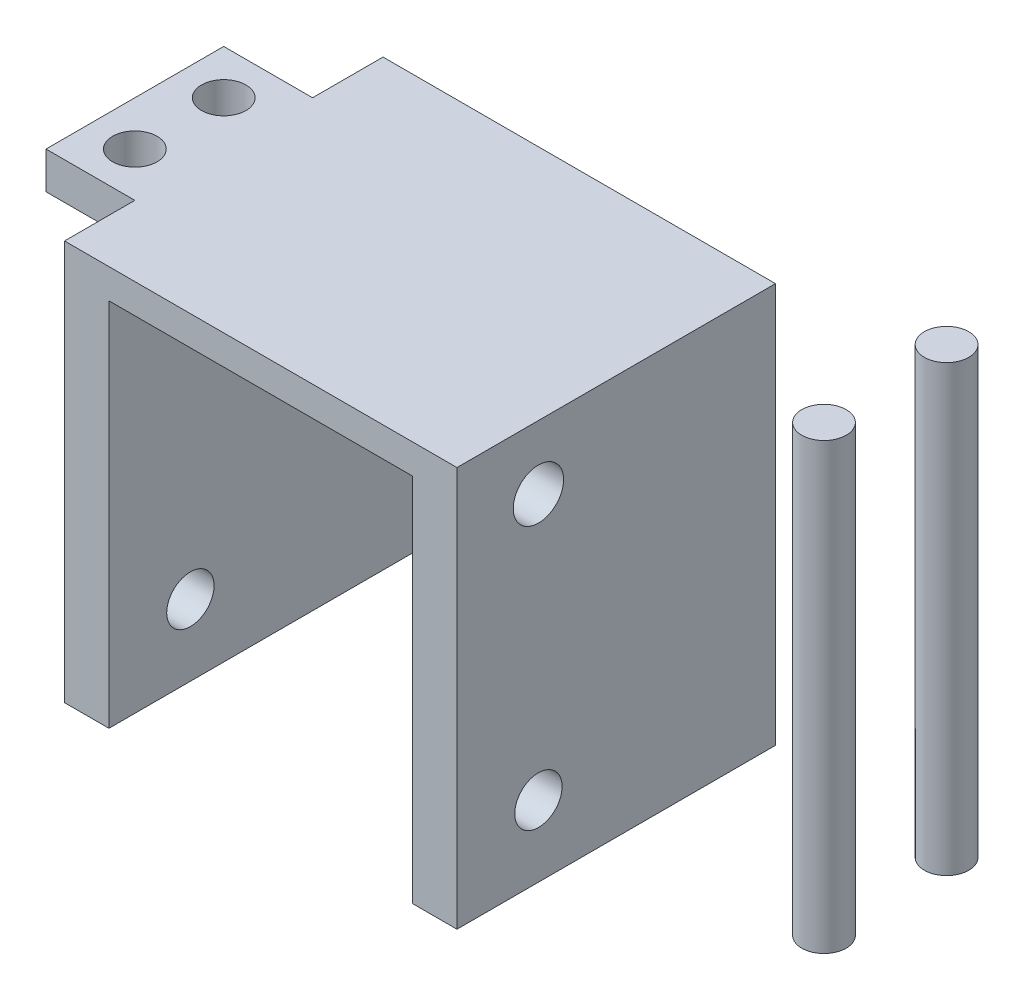
ISO-10303-21;
HEADER;
FILE_DESCRIPTION(('STEP AP214'),'2;1');
FILE_NAME('part.step','',(''),(''),'','','');
FILE_SCHEMA(('AUTOMOTIVE_DESIGN { 1 0 10303 214 1 1 1 1 }'));
ENDSEC;
DATA;
#1=APPLICATION_CONTEXT('core data for automotive mechanical design processes');
#2=APPLICATION_PROTOCOL_DEFINITION('international standard','automotive_design',2000,#1);
#3=PRODUCT_CONTEXT('',#1,'mechanical');
#4=PRODUCT('Part','Part','',(#3));
#5=PRODUCT_RELATED_PRODUCT_CATEGORY('part','',(#4));
#6=PRODUCT_DEFINITION_FORMATION('','',#4);
#7=PRODUCT_DEFINITION_CONTEXT('part definition',#1,'design');
#8=PRODUCT_DEFINITION('design','',#6,#7);
#9=PRODUCT_DEFINITION_SHAPE('','',#8);
#10=(LENGTH_UNIT() NAMED_UNIT(*) SI_UNIT(.MILLI.,.METRE.));
#11=(NAMED_UNIT(*) PLANE_ANGLE_UNIT() SI_UNIT($,.RADIAN.));
#12=(NAMED_UNIT(*) SI_UNIT($,.STERADIAN.) SOLID_ANGLE_UNIT());
#13=UNCERTAINTY_MEASURE_WITH_UNIT(LENGTH_MEASURE(1.E-05),#10,'distance_accuracy_value','');
#14=(GEOMETRIC_REPRESENTATION_CONTEXT(3) GLOBAL_UNCERTAINTY_ASSIGNED_CONTEXT((#13)) GLOBAL_UNIT_ASSIGNED_CONTEXT((#10,
#11,#12)) REPRESENTATION_CONTEXT('',''));
#15=CARTESIAN_POINT('',(0.,0.,0.));
#16=DIRECTION('',(0.,0.,1.));
#17=DIRECTION('',(1.,0.,0.));
#18=AXIS2_PLACEMENT_3D('',#15,#16,#17);
#19=CARTESIAN_POINT('',(7.57435055107238,-37.9640136599524,21.6698122934481));
#20=DIRECTION('',(0.,1.,0.));
#21=DIRECTION('',(-1.,0.,0.));
#22=AXIS2_PLACEMENT_3D('',#19,#20,#21);
#23=CYLINDRICAL_SURFACE('',#22,1.5);
#24=CARTESIAN_POINT('',(7.57435055107238,-37.9640136599524,21.6698122934481));
#25=DIRECTION('',(0.,1.,0.));
#26=DIRECTION('',(-1.,0.,0.));
#27=AXIS2_PLACEMENT_3D('',#24,#25,#26);
#28=CIRCLE('',#27,1.5);
#29=CARTESIAN_POINT('',(6.07435055107238,-37.9640136599524,21.6698122934481));
#30=VERTEX_POINT('',#29);
#31=EDGE_CURVE('E50',#30,#30,#28,.T.);
#32=ORIENTED_EDGE('',*,*,#31,.T.);
#33=EDGE_LOOP('',(#32));
#34=FACE_BOUND('',#33,.T.);
#35=CARTESIAN_POINT('',(7.57435055107237,-7.96401365995245,21.6698122934481));
#36=DIRECTION('',(0.,1.,0.));
#37=DIRECTION('',(-1.,0.,0.));
#38=AXIS2_PLACEMENT_3D('',#35,#36,#37);
#39=CIRCLE('',#38,1.5);
#40=CARTESIAN_POINT('',(6.07435055107237,-7.96401365995245,21.6698122934481));
#41=VERTEX_POINT('',#40);
#42=EDGE_CURVE('E11',#41,#41,#39,.T.);
#43=ORIENTED_EDGE('',*,*,#42,.F.);
#44=EDGE_LOOP('',(#43));
#45=FACE_BOUND('',#44,.T.);
#46=ADVANCED_FACE('F46',(#34,#45),#23,.T.);
#47=CARTESIAN_POINT('',(7.57435055107238,-37.9640136599524,21.6698122934481));
#48=DIRECTION('',(0.,1.,0.));
#49=DIRECTION('',(-1.,0.,0.));
#50=AXIS2_PLACEMENT_3D('',#47,#48,#49);
#51=PLANE('',#50);
#52=ORIENTED_EDGE('',*,*,#31,.F.);
#53=EDGE_LOOP('',(#52));
#54=FACE_BOUND('',#53,.T.);
#55=ADVANCED_FACE('F48',(#54),#51,.F.);
#56=CARTESIAN_POINT('',(7.57435055107237,-7.96401365995245,21.6698122934481));
#57=DIRECTION('',(0.,1.,0.));
#58=DIRECTION('',(-1.,0.,0.));
#59=AXIS2_PLACEMENT_3D('',#56,#57,#58);
#60=PLANE('',#59);
#61=ORIENTED_EDGE('',*,*,#42,.T.);
#62=EDGE_LOOP('',(#61));
#63=FACE_BOUND('',#62,.T.);
#64=ADVANCED_FACE('F62',(#63),#60,.T.);
#65=CLOSED_SHELL('',(#46,#55,#64));
#66=MANIFOLD_SOLID_BREP('B2',#65);
#67=CARTESIAN_POINT('',(7.15742755964301,-37.9640136599524,12.9739899007783));
#68=DIRECTION('',(0.,1.,0.));
#69=DIRECTION('',(-1.,0.,0.));
#70=AXIS2_PLACEMENT_3D('',#67,#68,#69);
#71=CYLINDRICAL_SURFACE('',#70,1.5);
#72=CARTESIAN_POINT('',(7.15742755964301,-37.9640136599524,12.9739899007783));
#73=DIRECTION('',(0.,1.,0.));
#74=DIRECTION('',(-1.,0.,0.));
#75=AXIS2_PLACEMENT_3D('',#72,#73,#74);
#76=CIRCLE('',#75,1.5);
#77=CARTESIAN_POINT('',(5.65742755964301,-37.9640136599524,12.9739899007783));
#78=VERTEX_POINT('',#77);
#79=EDGE_CURVE('E45',#78,#78,#76,.T.);
#80=ORIENTED_EDGE('',*,*,#79,.T.);
#81=EDGE_LOOP('',(#80));
#82=FACE_BOUND('',#81,.T.);
#83=CARTESIAN_POINT('',(7.15742755964301,-7.96401365995245,12.9739899007783));
#84=DIRECTION('',(0.,1.,0.));
#85=DIRECTION('',(-1.,0.,0.));
#86=AXIS2_PLACEMENT_3D('',#83,#84,#85);
#87=CIRCLE('',#86,1.5);
#88=CARTESIAN_POINT('',(5.657427559643,-7.96401365995245,12.9739899007783));
#89=VERTEX_POINT('',#88);
#90=EDGE_CURVE('E99',#89,#89,#87,.T.);
#91=ORIENTED_EDGE('',*,*,#90,.F.);
#92=EDGE_LOOP('',(#91));
#93=FACE_BOUND('',#92,.T.);
#94=ADVANCED_FACE('F96',(#82,#93),#71,.T.);
#95=CARTESIAN_POINT('',(7.15742755964301,-37.9640136599524,12.9739899007783));
#96=DIRECTION('',(0.,1.,0.));
#97=DIRECTION('',(-1.,0.,0.));
#98=AXIS2_PLACEMENT_3D('',#95,#96,#97);
#99=PLANE('',#98);
#100=ORIENTED_EDGE('',*,*,#79,.F.);
#101=EDGE_LOOP('',(#100));
#102=FACE_BOUND('',#101,.T.);
#103=ADVANCED_FACE('F111',(#102),#99,.F.);
#104=CARTESIAN_POINT('',(7.15742755964301,-7.96401365995245,12.9739899007783));
#105=DIRECTION('',(0.,1.,0.));
#106=DIRECTION('',(-1.,0.,0.));
#107=AXIS2_PLACEMENT_3D('',#104,#105,#106);
#108=PLANE('',#107);
#109=ORIENTED_EDGE('',*,*,#90,.T.);
#110=EDGE_LOOP('',(#109));
#111=FACE_BOUND('',#110,.T.);
#112=ADVANCED_FACE('F108',(#111),#108,.T.);
#113=CLOSED_SHELL('',(#94,#103,#112));
#114=MANIFOLD_SOLID_BREP('B6',#113);
#115=CARTESIAN_POINT('',(-28.677732695502,-34.9640136599525,36.7));
#116=DIRECTION('',(1.,0.,0.));
#117=DIRECTION('',(0.,1.,0.));
#118=AXIS2_PLACEMENT_3D('',#115,#116,#117);
#119=PLANE('',#118);
#120=CARTESIAN_POINT('',(-28.677732695502,-30.1640136599525,31.2));
#121=DIRECTION('',(1.,0.,0.));
#122=DIRECTION('',(0.,1.,0.));
#123=AXIS2_PLACEMENT_3D('',#120,#121,#122);
#124=CIRCLE('',#123,1.6);
#125=CARTESIAN_POINT('',(-28.677732695502,-28.5640136599525,31.2));
#126=VERTEX_POINT('',#125);
#127=EDGE_CURVE('E283',#126,#126,#124,.T.);
#128=ORIENTED_EDGE('',*,*,#127,.T.);
#129=EDGE_LOOP('',(#128));
#130=FACE_BOUND('',#129,.T.);
#131=CARTESIAN_POINT('',(-28.677732695502,-12.2640136599525,31.2));
#132=DIRECTION('',(1.,0.,0.));
#133=DIRECTION('',(0.,1.,0.));
#134=AXIS2_PLACEMENT_3D('',#131,#132,#133);
#135=CIRCLE('',#134,1.7);
#136=CARTESIAN_POINT('',(-28.677732695502,-10.5640136599525,31.2));
#137=VERTEX_POINT('',#136);
#138=EDGE_CURVE('E290',#137,#137,#135,.T.);
#139=ORIENTED_EDGE('',*,*,#138,.T.);
#140=EDGE_LOOP('',(#139));
#141=FACE_BOUND('',#140,.T.);
#142=DIRECTION('',(0.,1.,0.));
#143=VECTOR('',#142,1.);
#144=CARTESIAN_POINT('',(-28.677732695502,-7.96401365995246,31.95));
#145=LINE('',#144,#143);
#146=CARTESIAN_POINT('',(-28.677732695502,-10.4640136599525,31.95));
#147=VERTEX_POINT('',#146);
#148=CARTESIAN_POINT('',(-28.677732695502,-7.96401365995246,31.95));
#149=VERTEX_POINT('',#148);
#150=EDGE_CURVE('E153',#147,#149,#145,.T.);
#151=ORIENTED_EDGE('',*,*,#150,.F.);
#152=DIRECTION('',(0.,0.,1.));
#153=VECTOR('',#152,1.);
#154=CARTESIAN_POINT('',(-28.677732695502,-10.4640136599525,19.95));
#155=LINE('',#154,#153);
#156=CARTESIAN_POINT('',(-28.677732695502,-10.4640136599525,19.95));
#157=VERTEX_POINT('',#156);
#158=EDGE_CURVE('E247',#157,#147,#155,.T.);
#159=ORIENTED_EDGE('',*,*,#158,.F.);
#160=DIRECTION('',(0.,-1.,0.));
#161=VECTOR('',#160,1.);
#162=CARTESIAN_POINT('',(-28.677732695502,-7.96401365995246,19.95));
#163=LINE('',#162,#161);
#164=CARTESIAN_POINT('',(-28.677732695502,-7.96401365995246,19.95));
#165=VERTEX_POINT('',#164);
#166=EDGE_CURVE('E159',#165,#157,#163,.T.);
#167=ORIENTED_EDGE('',*,*,#166,.F.);
#168=DIRECTION('',(0.,0.,-1.));
#169=VECTOR('',#168,1.);
#170=CARTESIAN_POINT('',(-28.677732695502,-7.96401365995246,36.7));
#171=LINE('',#170,#169);
#172=CARTESIAN_POINT('',(-28.677732695502,-7.96401365995246,15.1914487752555));
#173=VERTEX_POINT('',#172);
#174=EDGE_CURVE('E325',#165,#173,#171,.T.);
#175=ORIENTED_EDGE('',*,*,#174,.T.);
#176=DIRECTION('',(0.,1.,0.));
#177=VECTOR('',#176,1.);
#178=CARTESIAN_POINT('',(-28.677732695502,-34.9640136599525,15.1914487752555));
#179=LINE('',#178,#177);
#180=CARTESIAN_POINT('',(-28.677732695502,-34.9640136599525,15.1914487752555));
#181=VERTEX_POINT('',#180);
#182=EDGE_CURVE('E250',#181,#173,#179,.T.);
#183=ORIENTED_EDGE('',*,*,#182,.F.);
#184=DIRECTION('',(0.,0.,-1.));
#185=VECTOR('',#184,1.);
#186=CARTESIAN_POINT('',(-28.677732695502,-34.9640136599525,36.7));
#187=LINE('',#186,#185);
#188=CARTESIAN_POINT('',(-28.677732695502,-34.9640136599525,36.7));
#189=VERTEX_POINT('',#188);
#190=EDGE_CURVE('E145',#189,#181,#187,.T.);
#191=ORIENTED_EDGE('',*,*,#190,.F.);
#192=DIRECTION('',(0.,-1.,0.));
#193=VECTOR('',#192,1.);
#194=CARTESIAN_POINT('',(-28.677732695502,-34.9640136599525,36.7));
#195=LINE('',#194,#193);
#196=CARTESIAN_POINT('',(-28.677732695502,-7.96401365995246,36.7));
#197=VERTEX_POINT('',#196);
#198=EDGE_CURVE('E306',#197,#189,#195,.T.);
#199=ORIENTED_EDGE('',*,*,#198,.F.);
#200=EDGE_CURVE('E326',#197,#149,#171,.T.);
#201=ORIENTED_EDGE('',*,*,#200,.T.);
#202=EDGE_LOOP('',(#151,#159,#167,#175,#183,#191,#199,#201));
#203=FACE_BOUND('',#202,.T.);
#204=ADVANCED_FACE('F137',(#130,#141,#203),#119,.F.);
#205=CARTESIAN_POINT('',(-2.17773269550204,-34.9640136599524,36.7));
#206=DIRECTION('',(0.,1.,0.));
#207=DIRECTION('',(-1.,0.,0.));
#208=AXIS2_PLACEMENT_3D('',#205,#206,#207);
#209=PLANE('',#208);
#210=DIRECTION('',(0.,0.,-1.));
#211=VECTOR('',#210,1.);
#212=CARTESIAN_POINT('',(-5.17773269550205,-34.9640136599525,36.7));
#213=LINE('',#212,#211);
#214=CARTESIAN_POINT('',(-5.17773269550205,-34.9640136599525,36.7));
#215=VERTEX_POINT('',#214);
#216=CARTESIAN_POINT('',(-5.17773269550205,-34.9640136599525,15.1914487752555));
#217=VERTEX_POINT('',#216);
#218=EDGE_CURVE('E302',#215,#217,#213,.T.);
#219=ORIENTED_EDGE('',*,*,#218,.T.);
#220=DIRECTION('',(-1.,0.,0.));
#221=VECTOR('',#220,1.);
#222=CARTESIAN_POINT('',(3.32226730449796,-34.9640136599525,15.1914487752555));
#223=LINE('',#222,#221);
#224=CARTESIAN_POINT('',(-2.17773269550204,-34.9640136599525,15.1914487752555));
#225=VERTEX_POINT('',#224);
#226=EDGE_CURVE('E260',#225,#217,#223,.T.);
#227=ORIENTED_EDGE('',*,*,#226,.F.);
#228=DIRECTION('',(0.,0.,-1.));
#229=VECTOR('',#228,1.);
#230=CARTESIAN_POINT('',(-2.17773269550204,-34.9640136599524,36.7));
#231=LINE('',#230,#229);
#232=CARTESIAN_POINT('',(-2.17773269550204,-34.9640136599524,36.7));
#233=VERTEX_POINT('',#232);
#234=EDGE_CURVE('E330',#233,#225,#231,.T.);
#235=ORIENTED_EDGE('',*,*,#234,.F.);
#236=DIRECTION('',(1.,0.,0.));
#237=VECTOR('',#236,1.);
#238=CARTESIAN_POINT('',(-2.17773269550204,-34.9640136599524,36.7));
#239=LINE('',#238,#237);
#240=EDGE_CURVE('E317',#215,#233,#239,.T.);
#241=ORIENTED_EDGE('',*,*,#240,.F.);
#242=EDGE_LOOP('',(#219,#227,#235,#241));
#243=FACE_BOUND('',#242,.T.);
#244=ADVANCED_FACE('F376',(#243),#209,.F.);
#245=ORIENTED_EDGE('',*,*,#190,.T.);
#246=CARTESIAN_POINT('',(-25.677732695502,-34.9640136599525,15.1914487752555));
#247=VERTEX_POINT('',#246);
#248=EDGE_CURVE('E253',#247,#181,#223,.T.);
#249=ORIENTED_EDGE('',*,*,#248,.F.);
#250=DIRECTION('',(0.,0.,-1.));
#251=VECTOR('',#250,1.);
#252=CARTESIAN_POINT('',(-25.677732695502,-34.9640136599525,36.7));
#253=LINE('',#252,#251);
#254=CARTESIAN_POINT('',(-25.677732695502,-34.9640136599525,36.7));
#255=VERTEX_POINT('',#254);
#256=EDGE_CURVE('E310',#255,#247,#253,.T.);
#257=ORIENTED_EDGE('',*,*,#256,.F.);
#258=EDGE_CURVE('E318',#189,#255,#239,.T.);
#259=ORIENTED_EDGE('',*,*,#258,.F.);
#260=EDGE_LOOP('',(#245,#249,#257,#259));
#261=FACE_BOUND('',#260,.T.);
#262=ADVANCED_FACE('F382',(#261),#209,.F.);
#263=CARTESIAN_POINT('',(-2.17773269550204,-34.9640136599524,36.7));
#264=DIRECTION('',(-1.,0.,0.));
#265=DIRECTION('',(0.,0.,1.));
#266=AXIS2_PLACEMENT_3D('',#263,#264,#265);
#267=PLANE('',#266);
#268=CARTESIAN_POINT('',(-2.17773269550204,-12.2640136599525,31.2));
#269=DIRECTION('',(1.,0.,0.));
#270=DIRECTION('',(0.,0.,-1.));
#271=AXIS2_PLACEMENT_3D('',#268,#269,#270);
#272=CIRCLE('',#271,1.7);
#273=CARTESIAN_POINT('',(-2.17773269550204,-12.2640136599525,29.5));
#274=VERTEX_POINT('',#273);
#275=EDGE_CURVE('E274',#274,#274,#272,.T.);
#276=ORIENTED_EDGE('',*,*,#275,.F.);
#277=EDGE_LOOP('',(#276));
#278=FACE_BOUND('',#277,.T.);
#279=CARTESIAN_POINT('',(-2.17773269550204,-30.1640136599525,31.2));
#280=DIRECTION('',(1.,0.,0.));
#281=DIRECTION('',(0.,0.,-1.));
#282=AXIS2_PLACEMENT_3D('',#279,#280,#281);
#283=CIRCLE('',#282,1.6);
#284=CARTESIAN_POINT('',(-2.17773269550204,-30.1640136599525,29.6));
#285=VERTEX_POINT('',#284);
#286=EDGE_CURVE('E273',#285,#285,#283,.T.);
#287=ORIENTED_EDGE('',*,*,#286,.F.);
#288=EDGE_LOOP('',(#287));
#289=FACE_BOUND('',#288,.T.);
#290=ORIENTED_EDGE('',*,*,#234,.T.);
#291=DIRECTION('',(0.,1.,0.));
#292=VECTOR('',#291,1.);
#293=CARTESIAN_POINT('',(-2.17773269550204,-34.9640136599524,15.1914487752555));
#294=LINE('',#293,#292);
#295=CARTESIAN_POINT('',(-2.17773269550204,-7.96401365995246,15.1914487752555));
#296=VERTEX_POINT('',#295);
#297=EDGE_CURVE('E270',#225,#296,#294,.T.);
#298=ORIENTED_EDGE('',*,*,#297,.T.);
#299=DIRECTION('',(0.,0.,-1.));
#300=VECTOR('',#299,1.);
#301=CARTESIAN_POINT('',(-2.17773269550204,-7.96401365995246,36.7));
#302=LINE('',#301,#300);
#303=CARTESIAN_POINT('',(-2.17773269550204,-7.96401365995246,36.7));
#304=VERTEX_POINT('',#303);
#305=EDGE_CURVE('E328',#304,#296,#302,.T.);
#306=ORIENTED_EDGE('',*,*,#305,.F.);
#307=DIRECTION('',(0.,1.,0.));
#308=VECTOR('',#307,1.);
#309=CARTESIAN_POINT('',(-2.17773269550204,-34.9640136599524,36.7));
#310=LINE('',#309,#308);
#311=EDGE_CURVE('E321',#233,#304,#310,.T.);
#312=ORIENTED_EDGE('',*,*,#311,.F.);
#313=EDGE_LOOP('',(#290,#298,#306,#312));
#314=FACE_BOUND('',#313,.T.);
#315=ADVANCED_FACE('F437',(#278,#289,#314),#267,.F.);
#316=CARTESIAN_POINT('',(-2.17773269550204,-7.96401365995246,36.7));
#317=DIRECTION('',(0.,-1.,0.));
#318=DIRECTION('',(1.,0.,0.));
#319=AXIS2_PLACEMENT_3D('',#316,#317,#318);
#320=PLANE('',#319);
#321=CARTESIAN_POINT('',(-31.677732695502,-7.96401365995246,22.95));
#322=DIRECTION('',(0.,1.,0.));
#323=DIRECTION('',(-1.,0.,0.));
#324=AXIS2_PLACEMENT_3D('',#321,#322,#323);
#325=CIRCLE('',#324,1.5);
#326=CARTESIAN_POINT('',(-33.177732695502,-7.96401365995246,22.95));
#327=VERTEX_POINT('',#326);
#328=EDGE_CURVE('E340',#327,#327,#325,.T.);
#329=ORIENTED_EDGE('',*,*,#328,.F.);
#330=EDGE_LOOP('',(#329));
#331=FACE_BOUND('',#330,.T.);
#332=CARTESIAN_POINT('',(-31.677732695502,-7.96401365995246,28.95));
#333=DIRECTION('',(0.,1.,0.));
#334=DIRECTION('',(-1.,0.,0.));
#335=AXIS2_PLACEMENT_3D('',#332,#333,#334);
#336=CIRCLE('',#335,1.5);
#337=CARTESIAN_POINT('',(-33.177732695502,-7.96401365995246,28.95));
#338=VERTEX_POINT('',#337);
#339=EDGE_CURVE('E345',#338,#338,#336,.T.);
#340=ORIENTED_EDGE('',*,*,#339,.F.);
#341=EDGE_LOOP('',(#340));
#342=FACE_BOUND('',#341,.T.);
#343=ORIENTED_EDGE('',*,*,#305,.T.);
#344=DIRECTION('',(-1.,0.,0.));
#345=VECTOR('',#344,1.);
#346=CARTESIAN_POINT('',(-2.17773269550204,-7.96401365995246,15.1914487752555));
#347=LINE('',#346,#345);
#348=EDGE_CURVE('E267',#296,#173,#347,.T.);
#349=ORIENTED_EDGE('',*,*,#348,.T.);
#350=ORIENTED_EDGE('',*,*,#174,.F.);
#351=DIRECTION('',(1.,0.,0.));
#352=VECTOR('',#351,1.);
#353=CARTESIAN_POINT('',(-34.677732695502,-7.96401365995246,19.95));
#354=LINE('',#353,#352);
#355=CARTESIAN_POINT('',(-34.677732695502,-7.96401365995246,19.95));
#356=VERTEX_POINT('',#355);
#357=EDGE_CURVE('E234',#356,#165,#354,.T.);
#358=ORIENTED_EDGE('',*,*,#357,.F.);
#359=DIRECTION('',(0.,0.,-1.));
#360=VECTOR('',#359,1.);
#361=CARTESIAN_POINT('',(-34.677732695502,-7.96401365995246,19.95));
#362=LINE('',#361,#360);
#363=CARTESIAN_POINT('',(-34.677732695502,-7.96401365995246,31.95));
#364=VERTEX_POINT('',#363);
#365=EDGE_CURVE('E226',#364,#356,#362,.T.);
#366=ORIENTED_EDGE('',*,*,#365,.F.);
#367=DIRECTION('',(1.,0.,0.));
#368=VECTOR('',#367,1.);
#369=CARTESIAN_POINT('',(-34.677732695502,-7.96401365995246,31.95));
#370=LINE('',#369,#368);
#371=EDGE_CURVE('E232',#364,#149,#370,.T.);
#372=ORIENTED_EDGE('',*,*,#371,.T.);
#373=ORIENTED_EDGE('',*,*,#200,.F.);
#374=DIRECTION('',(-1.,0.,0.));
#375=VECTOR('',#374,1.);
#376=CARTESIAN_POINT('',(-2.17773269550204,-7.96401365995246,36.7));
#377=LINE('',#376,#375);
#378=EDGE_CURVE('E323',#304,#197,#377,.T.);
#379=ORIENTED_EDGE('',*,*,#378,.F.);
#380=EDGE_LOOP('',(#343,#349,#350,#358,#366,#372,#373,#379));
#381=FACE_BOUND('',#380,.T.);
#382=ADVANCED_FACE('F229',(#331,#342,#381),#320,.F.);
#383=CARTESIAN_POINT('',(0.,0.,36.7));
#384=DIRECTION('',(0.,0.,1.));
#385=DIRECTION('',(1.,0.,0.));
#386=AXIS2_PLACEMENT_3D('',#383,#384,#385);
#387=PLANE('',#386);
#388=DIRECTION('',(0.,-1.,0.));
#389=VECTOR('',#388,1.);
#390=CARTESIAN_POINT('',(-5.17773269550205,-34.9640136599525,36.7));
#391=LINE('',#390,#389);
#392=CARTESIAN_POINT('',(-5.17773269550205,-9.96401365995246,36.7));
#393=VERTEX_POINT('',#392);
#394=EDGE_CURVE('E293',#393,#215,#391,.T.);
#395=ORIENTED_EDGE('',*,*,#394,.T.);
#396=ORIENTED_EDGE('',*,*,#240,.T.);
#397=ORIENTED_EDGE('',*,*,#311,.T.);
#398=ORIENTED_EDGE('',*,*,#378,.T.);
#399=ORIENTED_EDGE('',*,*,#198,.T.);
#400=ORIENTED_EDGE('',*,*,#258,.T.);
#401=DIRECTION('',(0.,1.,0.));
#402=VECTOR('',#401,1.);
#403=CARTESIAN_POINT('',(-25.677732695502,-34.9640136599525,36.7));
#404=LINE('',#403,#402);
#405=CARTESIAN_POINT('',(-25.677732695502,-9.96401365995246,36.7));
#406=VERTEX_POINT('',#405);
#407=EDGE_CURVE('E296',#255,#406,#404,.T.);
#408=ORIENTED_EDGE('',*,*,#407,.T.);
#409=DIRECTION('',(1.,0.,0.));
#410=VECTOR('',#409,1.);
#411=CARTESIAN_POINT('',(-25.677732695502,-9.96401365995246,36.7));
#412=LINE('',#411,#410);
#413=EDGE_CURVE('E299',#406,#393,#412,.T.);
#414=ORIENTED_EDGE('',*,*,#413,.T.);
#415=EDGE_LOOP('',(#395,#396,#397,#398,#399,#400,#408,#414));
#416=FACE_BOUND('',#415,.T.);
#417=ADVANCED_FACE('F418',(#416),#387,.T.);
#418=CARTESIAN_POINT('',(-5.17773269550205,-34.9640136599525,36.7));
#419=DIRECTION('',(1.,0.,0.));
#420=DIRECTION('',(0.,0.,-1.));
#421=AXIS2_PLACEMENT_3D('',#418,#419,#420);
#422=PLANE('',#421);
#423=CARTESIAN_POINT('',(-5.17773269550204,-12.2640136599525,31.2));
#424=DIRECTION('',(1.,0.,0.));
#425=DIRECTION('',(0.,0.,-1.));
#426=AXIS2_PLACEMENT_3D('',#423,#424,#425);
#427=CIRCLE('',#426,1.7);
#428=CARTESIAN_POINT('',(-5.17773269550204,-12.2640136599525,29.5));
#429=VERTEX_POINT('',#428);
#430=EDGE_CURVE('E287',#429,#429,#427,.T.);
#431=ORIENTED_EDGE('',*,*,#430,.T.);
#432=EDGE_LOOP('',(#431));
#433=FACE_BOUND('',#432,.T.);
#434=CARTESIAN_POINT('',(-5.17773269550204,-30.1640136599525,31.2));
#435=DIRECTION('',(1.,0.,0.));
#436=DIRECTION('',(0.,0.,-1.));
#437=AXIS2_PLACEMENT_3D('',#434,#435,#436);
#438=CIRCLE('',#437,1.6);
#439=CARTESIAN_POINT('',(-5.17773269550204,-30.1640136599525,29.6));
#440=VERTEX_POINT('',#439);
#441=EDGE_CURVE('E280',#440,#440,#438,.T.);
#442=ORIENTED_EDGE('',*,*,#441,.T.);
#443=EDGE_LOOP('',(#442));
#444=FACE_BOUND('',#443,.T.);
#445=DIRECTION('',(0.,0.,-1.));
#446=VECTOR('',#445,1.);
#447=CARTESIAN_POINT('',(-5.17773269550205,-9.96401365995246,36.7));
#448=LINE('',#447,#446);
#449=CARTESIAN_POINT('',(-5.17773269550205,-9.96401365995246,15.1914487752555));
#450=VERTEX_POINT('',#449);
#451=EDGE_CURVE('E303',#393,#450,#448,.T.);
#452=ORIENTED_EDGE('',*,*,#451,.T.);
#453=DIRECTION('',(0.,-1.,0.));
#454=VECTOR('',#453,1.);
#455=CARTESIAN_POINT('',(-5.17773269550205,-34.9640136599525,15.1914487752555));
#456=LINE('',#455,#454);
#457=EDGE_CURVE('E264',#450,#217,#456,.T.);
#458=ORIENTED_EDGE('',*,*,#457,.T.);
#459=ORIENTED_EDGE('',*,*,#218,.F.);
#460=ORIENTED_EDGE('',*,*,#394,.F.);
#461=EDGE_LOOP('',(#452,#458,#459,#460));
#462=FACE_BOUND('',#461,.T.);
#463=ADVANCED_FACE('F414',(#433,#444,#462),#422,.F.);
#464=CARTESIAN_POINT('',(-25.677732695502,-9.96401365995246,36.7));
#465=DIRECTION('',(0.,1.,0.));
#466=DIRECTION('',(-1.,0.,0.));
#467=AXIS2_PLACEMENT_3D('',#464,#465,#466);
#468=PLANE('',#467);
#469=DIRECTION('',(0.,0.,-1.));
#470=VECTOR('',#469,1.);
#471=CARTESIAN_POINT('',(-25.677732695502,-9.96401365995246,36.7));
#472=LINE('',#471,#470);
#473=CARTESIAN_POINT('',(-25.677732695502,-9.96401365995246,15.1914487752555));
#474=VERTEX_POINT('',#473);
#475=EDGE_CURVE('E307',#406,#474,#472,.T.);
#476=ORIENTED_EDGE('',*,*,#475,.T.);
#477=DIRECTION('',(1.,0.,0.));
#478=VECTOR('',#477,1.);
#479=CARTESIAN_POINT('',(-25.677732695502,-9.96401365995246,15.1914487752555));
#480=LINE('',#479,#478);
#481=EDGE_CURVE('E261',#474,#450,#480,.T.);
#482=ORIENTED_EDGE('',*,*,#481,.T.);
#483=ORIENTED_EDGE('',*,*,#451,.F.);
#484=ORIENTED_EDGE('',*,*,#413,.F.);
#485=EDGE_LOOP('',(#476,#482,#483,#484));
#486=FACE_BOUND('',#485,.T.);
#487=ADVANCED_FACE('F417',(#486),#468,.F.);
#488=CARTESIAN_POINT('',(-25.677732695502,-34.9640136599525,36.7));
#489=DIRECTION('',(-1.,0.,0.));
#490=DIRECTION('',(0.,0.,1.));
#491=AXIS2_PLACEMENT_3D('',#488,#489,#490);
#492=PLANE('',#491);
#493=CARTESIAN_POINT('',(-25.677732695502,-12.2640136599525,31.2));
#494=DIRECTION('',(-1.,0.,0.));
#495=DIRECTION('',(0.,0.,1.));
#496=AXIS2_PLACEMENT_3D('',#493,#494,#495);
#497=CIRCLE('',#496,1.7);
#498=CARTESIAN_POINT('',(-25.677732695502,-12.2640136599525,32.9));
#499=VERTEX_POINT('',#498);
#500=EDGE_CURVE('E286',#499,#499,#497,.T.);
#501=ORIENTED_EDGE('',*,*,#500,.T.);
#502=EDGE_LOOP('',(#501));
#503=FACE_BOUND('',#502,.T.);
#504=CARTESIAN_POINT('',(-25.677732695502,-30.1640136599525,31.2));
#505=DIRECTION('',(-1.,0.,0.));
#506=DIRECTION('',(0.,0.,1.));
#507=AXIS2_PLACEMENT_3D('',#504,#505,#506);
#508=CIRCLE('',#507,1.6);
#509=CARTESIAN_POINT('',(-25.677732695502,-30.1640136599525,32.8));
#510=VERTEX_POINT('',#509);
#511=EDGE_CURVE('E277',#510,#510,#508,.T.);
#512=ORIENTED_EDGE('',*,*,#511,.T.);
#513=EDGE_LOOP('',(#512));
#514=FACE_BOUND('',#513,.T.);
#515=ORIENTED_EDGE('',*,*,#256,.T.);
#516=DIRECTION('',(0.,1.,0.));
#517=VECTOR('',#516,1.);
#518=CARTESIAN_POINT('',(-25.677732695502,-34.9640136599525,15.1914487752555));
#519=LINE('',#518,#517);
#520=EDGE_CURVE('E94',#247,#474,#519,.T.);
#521=ORIENTED_EDGE('',*,*,#520,.T.);
#522=ORIENTED_EDGE('',*,*,#475,.F.);
#523=ORIENTED_EDGE('',*,*,#407,.F.);
#524=EDGE_LOOP('',(#515,#521,#522,#523));
#525=FACE_BOUND('',#524,.T.);
#526=ADVANCED_FACE('F401',(#503,#514,#525),#492,.F.);
#527=CARTESIAN_POINT('',(-38.877732695502,-30.1640136599525,31.2));
#528=DIRECTION('',(1.,0.,0.));
#529=DIRECTION('',(0.,0.,-1.));
#530=AXIS2_PLACEMENT_3D('',#527,#528,#529);
#531=CYLINDRICAL_SURFACE('',#530,1.6);
#532=ORIENTED_EDGE('',*,*,#511,.F.);
#533=EDGE_LOOP('',(#532));
#534=FACE_BOUND('',#533,.T.);
#535=ORIENTED_EDGE('',*,*,#127,.F.);
#536=EDGE_LOOP('',(#535));
#537=FACE_BOUND('',#536,.T.);
#538=ADVANCED_FACE('F391',(#534,#537),#531,.F.);
#539=CARTESIAN_POINT('',(-38.877732695502,-12.2640136599525,31.2));
#540=DIRECTION('',(1.,0.,0.));
#541=DIRECTION('',(0.,0.,-1.));
#542=AXIS2_PLACEMENT_3D('',#539,#540,#541);
#543=CYLINDRICAL_SURFACE('',#542,1.7);
#544=ORIENTED_EDGE('',*,*,#500,.F.);
#545=EDGE_LOOP('',(#544));
#546=FACE_BOUND('',#545,.T.);
#547=ORIENTED_EDGE('',*,*,#138,.F.);
#548=EDGE_LOOP('',(#547));
#549=FACE_BOUND('',#548,.T.);
#550=ADVANCED_FACE('F388',(#546,#549),#543,.F.);
#551=ORIENTED_EDGE('',*,*,#286,.T.);
#552=EDGE_LOOP('',(#551));
#553=FACE_BOUND('',#552,.T.);
#554=ORIENTED_EDGE('',*,*,#441,.F.);
#555=EDGE_LOOP('',(#554));
#556=FACE_BOUND('',#555,.T.);
#557=ADVANCED_FACE('F390',(#553,#556),#531,.F.);
#558=ORIENTED_EDGE('',*,*,#275,.T.);
#559=EDGE_LOOP('',(#558));
#560=FACE_BOUND('',#559,.T.);
#561=ORIENTED_EDGE('',*,*,#430,.F.);
#562=EDGE_LOOP('',(#561));
#563=FACE_BOUND('',#562,.T.);
#564=ADVANCED_FACE('F394',(#560,#563),#543,.F.);
#565=CARTESIAN_POINT('',(3.32226730449796,-34.9640136599525,15.1914487752555));
#566=DIRECTION('',(0.,0.,1.));
#567=DIRECTION('',(1.,0.,0.));
#568=AXIS2_PLACEMENT_3D('',#565,#566,#567);
#569=PLANE('',#568);
#570=ORIENTED_EDGE('',*,*,#226,.T.);
#571=ORIENTED_EDGE('',*,*,#457,.F.);
#572=ORIENTED_EDGE('',*,*,#481,.F.);
#573=ORIENTED_EDGE('',*,*,#520,.F.);
#574=ORIENTED_EDGE('',*,*,#248,.T.);
#575=ORIENTED_EDGE('',*,*,#182,.T.);
#576=ORIENTED_EDGE('',*,*,#348,.F.);
#577=ORIENTED_EDGE('',*,*,#297,.F.);
#578=EDGE_LOOP('',(#570,#571,#572,#573,#574,#575,#576,#577));
#579=FACE_BOUND('',#578,.T.);
#580=ADVANCED_FACE('F373',(#579),#569,.F.);
#581=CARTESIAN_POINT('',(-34.677732695502,-7.96401365995246,31.95));
#582=DIRECTION('',(0.,0.,-1.));
#583=DIRECTION('',(-1.,0.,0.));
#584=AXIS2_PLACEMENT_3D('',#581,#582,#583);
#585=PLANE('',#584);
#586=ORIENTED_EDGE('',*,*,#150,.T.);
#587=ORIENTED_EDGE('',*,*,#371,.F.);
#588=DIRECTION('',(0.,1.,0.));
#589=VECTOR('',#588,1.);
#590=CARTESIAN_POINT('',(-34.677732695502,-7.96401365995246,31.95));
#591=LINE('',#590,#589);
#592=CARTESIAN_POINT('',(-34.677732695502,-10.4640136599525,31.95));
#593=VERTEX_POINT('',#592);
#594=EDGE_CURVE('E238',#593,#364,#591,.T.);
#595=ORIENTED_EDGE('',*,*,#594,.F.);
#596=DIRECTION('',(1.,0.,0.));
#597=VECTOR('',#596,1.);
#598=CARTESIAN_POINT('',(-34.677732695502,-10.4640136599525,31.95));
#599=LINE('',#598,#597);
#600=EDGE_CURVE('E354',#593,#147,#599,.T.);
#601=ORIENTED_EDGE('',*,*,#600,.T.);
#602=EDGE_LOOP('',(#586,#587,#595,#601));
#603=FACE_BOUND('',#602,.T.);
#604=ADVANCED_FACE('F249',(#603),#585,.F.);
#605=CARTESIAN_POINT('',(-34.677732695502,-7.96401365995246,19.95));
#606=DIRECTION('',(0.,0.,1.));
#607=DIRECTION('',(0.,-1.,0.));
#608=AXIS2_PLACEMENT_3D('',#605,#606,#607);
#609=PLANE('',#608);
#610=ORIENTED_EDGE('',*,*,#166,.T.);
#611=DIRECTION('',(1.,0.,0.));
#612=VECTOR('',#611,1.);
#613=CARTESIAN_POINT('',(-34.677732695502,-10.4640136599525,19.95));
#614=LINE('',#613,#612);
#615=CARTESIAN_POINT('',(-34.677732695502,-10.4640136599525,19.95));
#616=VERTEX_POINT('',#615);
#617=EDGE_CURVE('E255',#616,#157,#614,.T.);
#618=ORIENTED_EDGE('',*,*,#617,.F.);
#619=DIRECTION('',(0.,-1.,0.));
#620=VECTOR('',#619,1.);
#621=CARTESIAN_POINT('',(-34.677732695502,-7.96401365995246,19.95));
#622=LINE('',#621,#620);
#623=EDGE_CURVE('E237',#356,#616,#622,.T.);
#624=ORIENTED_EDGE('',*,*,#623,.F.);
#625=ORIENTED_EDGE('',*,*,#357,.T.);
#626=EDGE_LOOP('',(#610,#618,#624,#625));
#627=FACE_BOUND('',#626,.T.);
#628=ADVANCED_FACE('F363',(#627),#609,.F.);
#629=CARTESIAN_POINT('',(-34.677732695502,-10.4640136599525,19.95));
#630=DIRECTION('',(0.,1.,0.));
#631=DIRECTION('',(-1.,0.,0.));
#632=AXIS2_PLACEMENT_3D('',#629,#630,#631);
#633=PLANE('',#632);
#634=CARTESIAN_POINT('',(-31.677732695502,-10.4640136599525,22.95));
#635=DIRECTION('',(0.,1.,0.));
#636=DIRECTION('',(-1.,0.,0.));
#637=AXIS2_PLACEMENT_3D('',#634,#635,#636);
#638=CIRCLE('',#637,1.5);
#639=CARTESIAN_POINT('',(-33.177732695502,-10.4640136599525,22.95));
#640=VERTEX_POINT('',#639);
#641=EDGE_CURVE('E140',#640,#640,#638,.T.);
#642=ORIENTED_EDGE('',*,*,#641,.T.);
#643=EDGE_LOOP('',(#642));
#644=FACE_BOUND('',#643,.T.);
#645=CARTESIAN_POINT('',(-31.677732695502,-10.4640136599525,28.95));
#646=DIRECTION('',(0.,1.,0.));
#647=DIRECTION('',(-1.,0.,0.));
#648=AXIS2_PLACEMENT_3D('',#645,#646,#647);
#649=CIRCLE('',#648,1.5);
#650=CARTESIAN_POINT('',(-33.177732695502,-10.4640136599525,28.95));
#651=VERTEX_POINT('',#650);
#652=EDGE_CURVE('E338',#651,#651,#649,.T.);
#653=ORIENTED_EDGE('',*,*,#652,.T.);
#654=EDGE_LOOP('',(#653));
#655=FACE_BOUND('',#654,.T.);
#656=ORIENTED_EDGE('',*,*,#158,.T.);
#657=ORIENTED_EDGE('',*,*,#600,.F.);
#658=DIRECTION('',(0.,0.,1.));
#659=VECTOR('',#658,1.);
#660=CARTESIAN_POINT('',(-34.677732695502,-10.4640136599525,19.95));
#661=LINE('',#660,#659);
#662=EDGE_CURVE('E243',#616,#593,#661,.T.);
#663=ORIENTED_EDGE('',*,*,#662,.F.);
#664=ORIENTED_EDGE('',*,*,#617,.T.);
#665=EDGE_LOOP('',(#656,#657,#663,#664));
#666=FACE_BOUND('',#665,.T.);
#667=ADVANCED_FACE('F361',(#644,#655,#666),#633,.F.);
#668=CARTESIAN_POINT('',(-34.677732695502,0.,0.));
#669=DIRECTION('',(-1.,0.,0.));
#670=DIRECTION('',(0.,0.,1.));
#671=AXIS2_PLACEMENT_3D('',#668,#669,#670);
#672=PLANE('',#671);
#673=ORIENTED_EDGE('',*,*,#594,.T.);
#674=ORIENTED_EDGE('',*,*,#365,.T.);
#675=ORIENTED_EDGE('',*,*,#623,.T.);
#676=ORIENTED_EDGE('',*,*,#662,.T.);
#677=EDGE_LOOP('',(#673,#674,#675,#676));
#678=FACE_BOUND('',#677,.T.);
#679=ADVANCED_FACE('F241',(#678),#672,.T.);
#680=CARTESIAN_POINT('',(-31.677732695502,-13.9640136599525,28.95));
#681=DIRECTION('',(0.,1.,0.));
#682=DIRECTION('',(-1.,0.,0.));
#683=AXIS2_PLACEMENT_3D('',#680,#681,#682);
#684=CYLINDRICAL_SURFACE('',#683,1.5);
#685=ORIENTED_EDGE('',*,*,#339,.T.);
#686=EDGE_LOOP('',(#685));
#687=FACE_BOUND('',#686,.T.);
#688=ORIENTED_EDGE('',*,*,#652,.F.);
#689=EDGE_LOOP('',(#688));
#690=FACE_BOUND('',#689,.T.);
#691=ADVANCED_FACE('F516',(#687,#690),#684,.F.);
#692=CARTESIAN_POINT('',(-31.677732695502,-13.9640136599525,22.95));
#693=DIRECTION('',(0.,1.,0.));
#694=DIRECTION('',(-1.,0.,0.));
#695=AXIS2_PLACEMENT_3D('',#692,#693,#694);
#696=CYLINDRICAL_SURFACE('',#695,1.5);
#697=ORIENTED_EDGE('',*,*,#328,.T.);
#698=EDGE_LOOP('',(#697));
#699=FACE_BOUND('',#698,.T.);
#700=ORIENTED_EDGE('',*,*,#641,.F.);
#701=EDGE_LOOP('',(#700));
#702=FACE_BOUND('',#701,.T.);
#703=ADVANCED_FACE('F524',(#699,#702),#696,.F.);
#704=CLOSED_SHELL('',(#204,#244,#262,#315,#382,#417,#463,#487,#526,#538,#550,#557,#564,#580,
#604,#628,#667,#679,#691,#703));
#705=MANIFOLD_SOLID_BREP('B40',#704);
#706=ADVANCED_BREP_SHAPE_REPRESENTATION('',(#18,#66,#114,#705),#14);
#707=SHAPE_DEFINITION_REPRESENTATION(#9,#706);
ENDSEC;
END-ISO-10303-21;
